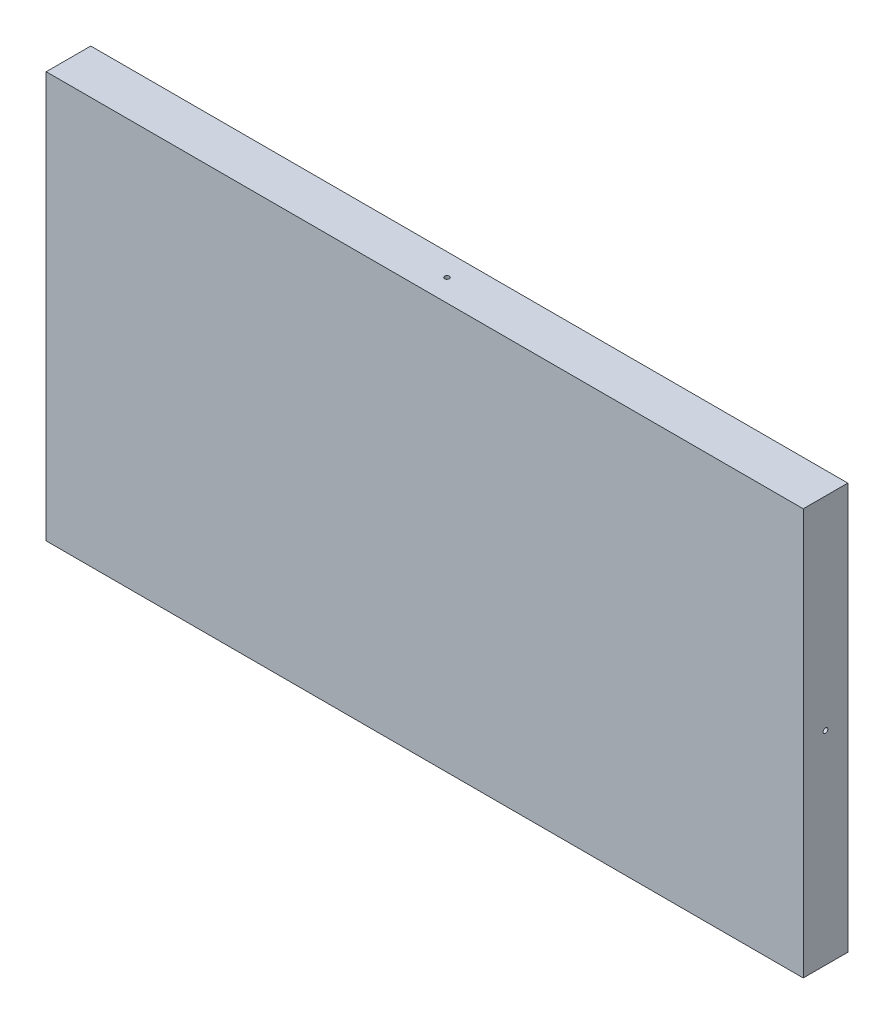
ISO-10303-21;
HEADER;
FILE_DESCRIPTION(('STEP AP214'),'2;1');
FILE_NAME('part.step','',(''),(''),'','','');
FILE_SCHEMA(('AUTOMOTIVE_DESIGN { 1 0 10303 214 1 1 1 1 }'));
ENDSEC;
DATA;
#1=APPLICATION_CONTEXT('core data for automotive mechanical design processes');
#2=APPLICATION_PROTOCOL_DEFINITION('international standard','automotive_design',2000,#1);
#3=PRODUCT_CONTEXT('',#1,'mechanical');
#4=PRODUCT('Part','Part','',(#3));
#5=PRODUCT_RELATED_PRODUCT_CATEGORY('part','',(#4));
#6=PRODUCT_DEFINITION_FORMATION('','',#4);
#7=PRODUCT_DEFINITION_CONTEXT('part definition',#1,'design');
#8=PRODUCT_DEFINITION('design','',#6,#7);
#9=PRODUCT_DEFINITION_SHAPE('','',#8);
#10=(LENGTH_UNIT() NAMED_UNIT(*) SI_UNIT(.MILLI.,.METRE.));
#11=(NAMED_UNIT(*) PLANE_ANGLE_UNIT() SI_UNIT($,.RADIAN.));
#12=(NAMED_UNIT(*) SI_UNIT($,.STERADIAN.) SOLID_ANGLE_UNIT());
#13=UNCERTAINTY_MEASURE_WITH_UNIT(LENGTH_MEASURE(1.E-05),#10,'distance_accuracy_value','');
#14=(GEOMETRIC_REPRESENTATION_CONTEXT(3) GLOBAL_UNCERTAINTY_ASSIGNED_CONTEXT((#13)) GLOBAL_UNIT_ASSIGNED_CONTEXT((#10,
#11,#12)) REPRESENTATION_CONTEXT('',''));
#15=CARTESIAN_POINT('',(0.,0.,0.));
#16=DIRECTION('',(0.,0.,1.));
#17=DIRECTION('',(1.,0.,0.));
#18=AXIS2_PLACEMENT_3D('',#15,#16,#17);
#19=CARTESIAN_POINT('',(0.,-182.5,20.));
#20=DIRECTION('',(0.,-1.,0.));
#21=DIRECTION('',(0.,0.,-1.));
#22=AXIS2_PLACEMENT_3D('',#19,#20,#21);
#23=CYLINDRICAL_SURFACE('',#22,2.09999999999997);
#24=CARTESIAN_POINT('',(0.,-182.5,20.));
#25=DIRECTION('',(0.,-1.,0.));
#26=DIRECTION('',(0.,0.,-1.));
#27=AXIS2_PLACEMENT_3D('',#24,#25,#26);
#28=CIRCLE('',#27,2.09999999999999);
#29=CARTESIAN_POINT('',(0.,-182.5,17.9));
#30=VERTEX_POINT('',#29);
#31=EDGE_CURVE('E154',#30,#30,#28,.T.);
#32=ORIENTED_EDGE('',*,*,#31,.T.);
#33=EDGE_LOOP('',(#32));
#34=FACE_BOUND('',#33,.T.);
#35=CARTESIAN_POINT('',(0.,0.,20.));
#36=DIRECTION('',(0.707106781186547,-0.707106781186547,0.));
#37=DIRECTION('',(-0.707106781186547,-0.707106781186547,0.));
#38=AXIS2_PLACEMENT_3D('',#35,#36,#37);
#39=ELLIPSE('',#38,2.96984848098344,2.09999999999996);
#40=CARTESIAN_POINT('',(0.,0.,17.9));
#41=VERTEX_POINT('',#40);
#42=CARTESIAN_POINT('',(0.,0.,22.1));
#43=VERTEX_POINT('',#42);
#44=EDGE_CURVE('E57',#41,#43,#39,.F.);
#45=ORIENTED_EDGE('',*,*,#44,.T.);
#46=CARTESIAN_POINT('',(0.,0.,20.));
#47=DIRECTION('',(-0.707106781186547,-0.707106781186547,0.));
#48=DIRECTION('',(0.707106781186547,-0.707106781186547,0.));
#49=AXIS2_PLACEMENT_3D('',#46,#47,#48);
#50=ELLIPSE('',#49,2.96984848098344,2.09999999999996);
#51=EDGE_CURVE('E11',#43,#41,#50,.F.);
#52=ORIENTED_EDGE('',*,*,#51,.T.);
#53=EDGE_LOOP('',(#45,#52));
#54=FACE_BOUND('',#53,.T.);
#55=ADVANCED_FACE('F43',(#34,#54),#23,.F.);
#56=CARTESIAN_POINT('',(340.,182.5,40.));
#57=DIRECTION('',(-1.,0.,0.));
#58=DIRECTION('',(0.,-1.,0.));
#59=AXIS2_PLACEMENT_3D('',#56,#57,#58);
#60=PLANE('',#59);
#61=CARTESIAN_POINT('',(340.,0.,20.));
#62=DIRECTION('',(-1.,0.,0.));
#63=DIRECTION('',(0.,0.,1.));
#64=AXIS2_PLACEMENT_3D('',#61,#62,#63);
#65=CIRCLE('',#64,2.09999999999992);
#66=CARTESIAN_POINT('',(340.,0.,22.0999999999999));
#67=VERTEX_POINT('',#66);
#68=EDGE_CURVE('E158',#67,#67,#65,.T.);
#69=ORIENTED_EDGE('',*,*,#68,.T.);
#70=EDGE_LOOP('',(#69));
#71=FACE_BOUND('',#70,.T.);
#72=DIRECTION('',(0.,1.,0.));
#73=VECTOR('',#72,1.);
#74=CARTESIAN_POINT('',(340.,182.5,0.));
#75=LINE('',#74,#73);
#76=CARTESIAN_POINT('',(340.,-182.5,0.));
#77=VERTEX_POINT('',#76);
#78=CARTESIAN_POINT('',(340.,182.5,0.));
#79=VERTEX_POINT('',#78);
#80=EDGE_CURVE('E137',#77,#79,#75,.T.);
#81=ORIENTED_EDGE('',*,*,#80,.T.);
#82=DIRECTION('',(0.,0.,-1.));
#83=VECTOR('',#82,1.);
#84=CARTESIAN_POINT('',(340.,182.5,40.));
#85=LINE('',#84,#83);
#86=CARTESIAN_POINT('',(340.,182.5,40.));
#87=VERTEX_POINT('',#86);
#88=EDGE_CURVE('E110',#87,#79,#85,.T.);
#89=ORIENTED_EDGE('',*,*,#88,.F.);
#90=DIRECTION('',(0.,1.,0.));
#91=VECTOR('',#90,1.);
#92=CARTESIAN_POINT('',(340.,182.5,40.));
#93=LINE('',#92,#91);
#94=CARTESIAN_POINT('',(340.,-182.5,40.));
#95=VERTEX_POINT('',#94);
#96=EDGE_CURVE('E130',#95,#87,#93,.T.);
#97=ORIENTED_EDGE('',*,*,#96,.F.);
#98=DIRECTION('',(0.,0.,-1.));
#99=VECTOR('',#98,1.);
#100=CARTESIAN_POINT('',(340.,-182.5,40.));
#101=LINE('',#100,#99);
#102=EDGE_CURVE('E125',#95,#77,#101,.T.);
#103=ORIENTED_EDGE('',*,*,#102,.T.);
#104=EDGE_LOOP('',(#81,#89,#97,#103));
#105=FACE_BOUND('',#104,.T.);
#106=ADVANCED_FACE('F45',(#71,#105),#60,.F.);
#107=CARTESIAN_POINT('',(-340.,182.5,40.));
#108=DIRECTION('',(0.,-1.,0.));
#109=DIRECTION('',(1.,0.,0.));
#110=AXIS2_PLACEMENT_3D('',#107,#108,#109);
#111=PLANE('',#110);
#112=CARTESIAN_POINT('',(0.,182.5,20.));
#113=DIRECTION('',(0.,-1.,0.));
#114=DIRECTION('',(0.,0.,-1.));
#115=AXIS2_PLACEMENT_3D('',#112,#113,#114);
#116=CIRCLE('',#115,2.09999999999995);
#117=CARTESIAN_POINT('',(0.,182.5,17.9));
#118=VERTEX_POINT('',#117);
#119=EDGE_CURVE('E141',#118,#118,#116,.T.);
#120=ORIENTED_EDGE('',*,*,#119,.T.);
#121=EDGE_LOOP('',(#120));
#122=FACE_BOUND('',#121,.T.);
#123=DIRECTION('',(-1.,0.,0.));
#124=VECTOR('',#123,1.);
#125=CARTESIAN_POINT('',(-340.,182.5,0.));
#126=LINE('',#125,#124);
#127=CARTESIAN_POINT('',(-340.,182.5,0.));
#128=VERTEX_POINT('',#127);
#129=EDGE_CURVE('E134',#79,#128,#126,.T.);
#130=ORIENTED_EDGE('',*,*,#129,.T.);
#131=DIRECTION('',(0.,0.,-1.));
#132=VECTOR('',#131,1.);
#133=CARTESIAN_POINT('',(-340.,182.5,40.));
#134=LINE('',#133,#132);
#135=CARTESIAN_POINT('',(-340.,182.5,40.));
#136=VERTEX_POINT('',#135);
#137=EDGE_CURVE('E118',#136,#128,#134,.T.);
#138=ORIENTED_EDGE('',*,*,#137,.F.);
#139=DIRECTION('',(-1.,0.,0.));
#140=VECTOR('',#139,1.);
#141=CARTESIAN_POINT('',(-340.,182.5,40.));
#142=LINE('',#141,#140);
#143=EDGE_CURVE('E95',#87,#136,#142,.T.);
#144=ORIENTED_EDGE('',*,*,#143,.F.);
#145=ORIENTED_EDGE('',*,*,#88,.T.);
#146=EDGE_LOOP('',(#130,#138,#144,#145));
#147=FACE_BOUND('',#146,.T.);
#148=ADVANCED_FACE('F172',(#122,#147),#111,.F.);
#149=CARTESIAN_POINT('',(-340.,182.5,40.));
#150=DIRECTION('',(1.,0.,0.));
#151=DIRECTION('',(0.,1.,0.));
#152=AXIS2_PLACEMENT_3D('',#149,#150,#151);
#153=PLANE('',#152);
#154=CARTESIAN_POINT('',(-340.,0.,20.));
#155=DIRECTION('',(-1.,0.,0.));
#156=DIRECTION('',(0.,0.,1.));
#157=AXIS2_PLACEMENT_3D('',#154,#155,#156);
#158=CIRCLE('',#157,2.09999999999999);
#159=CARTESIAN_POINT('',(-340.,0.,22.1));
#160=VERTEX_POINT('',#159);
#161=EDGE_CURVE('E162',#160,#160,#158,.T.);
#162=ORIENTED_EDGE('',*,*,#161,.F.);
#163=EDGE_LOOP('',(#162));
#164=FACE_BOUND('',#163,.T.);
#165=DIRECTION('',(0.,-1.,0.));
#166=VECTOR('',#165,1.);
#167=CARTESIAN_POINT('',(-340.,182.5,0.));
#168=LINE('',#167,#166);
#169=CARTESIAN_POINT('',(-340.,-182.5,0.));
#170=VERTEX_POINT('',#169);
#171=EDGE_CURVE('E131',#128,#170,#168,.T.);
#172=ORIENTED_EDGE('',*,*,#171,.T.);
#173=DIRECTION('',(0.,0.,-1.));
#174=VECTOR('',#173,1.);
#175=CARTESIAN_POINT('',(-340.,-182.5,40.));
#176=LINE('',#175,#174);
#177=CARTESIAN_POINT('',(-340.,-182.5,40.));
#178=VERTEX_POINT('',#177);
#179=EDGE_CURVE('E122',#178,#170,#176,.T.);
#180=ORIENTED_EDGE('',*,*,#179,.F.);
#181=DIRECTION('',(0.,-1.,0.));
#182=VECTOR('',#181,1.);
#183=CARTESIAN_POINT('',(-340.,182.5,40.));
#184=LINE('',#183,#182);
#185=EDGE_CURVE('E144',#136,#178,#184,.T.);
#186=ORIENTED_EDGE('',*,*,#185,.F.);
#187=ORIENTED_EDGE('',*,*,#137,.T.);
#188=EDGE_LOOP('',(#172,#180,#186,#187));
#189=FACE_BOUND('',#188,.T.);
#190=ADVANCED_FACE('F168',(#164,#189),#153,.F.);
#191=CARTESIAN_POINT('',(-340.,-182.5,40.));
#192=DIRECTION('',(0.,1.,0.));
#193=DIRECTION('',(0.,0.,1.));
#194=AXIS2_PLACEMENT_3D('',#191,#192,#193);
#195=PLANE('',#194);
#196=ORIENTED_EDGE('',*,*,#31,.F.);
#197=EDGE_LOOP('',(#196));
#198=FACE_BOUND('',#197,.T.);
#199=DIRECTION('',(1.,0.,0.));
#200=VECTOR('',#199,1.);
#201=CARTESIAN_POINT('',(-340.,-182.5,0.));
#202=LINE('',#201,#200);
#203=EDGE_CURVE('E87',#170,#77,#202,.T.);
#204=ORIENTED_EDGE('',*,*,#203,.T.);
#205=ORIENTED_EDGE('',*,*,#102,.F.);
#206=DIRECTION('',(1.,0.,0.));
#207=VECTOR('',#206,1.);
#208=CARTESIAN_POINT('',(-340.,-182.5,40.));
#209=LINE('',#208,#207);
#210=EDGE_CURVE('E66',#178,#95,#209,.T.);
#211=ORIENTED_EDGE('',*,*,#210,.F.);
#212=ORIENTED_EDGE('',*,*,#179,.T.);
#213=EDGE_LOOP('',(#204,#205,#211,#212));
#214=FACE_BOUND('',#213,.T.);
#215=ADVANCED_FACE('F171',(#198,#214),#195,.F.);
#216=CARTESIAN_POINT('',(0.,0.,40.));
#217=DIRECTION('',(0.,0.,1.));
#218=DIRECTION('',(1.,0.,0.));
#219=AXIS2_PLACEMENT_3D('',#216,#217,#218);
#220=PLANE('',#219);
#221=ORIENTED_EDGE('',*,*,#96,.T.);
#222=ORIENTED_EDGE('',*,*,#143,.T.);
#223=ORIENTED_EDGE('',*,*,#185,.T.);
#224=ORIENTED_EDGE('',*,*,#210,.T.);
#225=EDGE_LOOP('',(#221,#222,#223,#224));
#226=FACE_BOUND('',#225,.T.);
#227=ADVANCED_FACE('F183',(#226),#220,.T.);
#228=CARTESIAN_POINT('',(0.,0.,0.));
#229=DIRECTION('',(0.,0.,1.));
#230=DIRECTION('',(1.,0.,0.));
#231=AXIS2_PLACEMENT_3D('',#228,#229,#230);
#232=PLANE('',#231);
#233=ORIENTED_EDGE('',*,*,#80,.F.);
#234=ORIENTED_EDGE('',*,*,#203,.F.);
#235=ORIENTED_EDGE('',*,*,#171,.F.);
#236=ORIENTED_EDGE('',*,*,#129,.F.);
#237=EDGE_LOOP('',(#233,#234,#235,#236));
#238=FACE_BOUND('',#237,.T.);
#239=ADVANCED_FACE('F179',(#238),#232,.F.);
#240=CARTESIAN_POINT('',(0.,0.,20.));
#241=DIRECTION('',(0.707106781186547,-0.707106781186547,0.));
#242=DIRECTION('',(-0.707106781186547,-0.707106781186547,0.));
#243=AXIS2_PLACEMENT_3D('',#240,#241,#242);
#244=ELLIPSE('',#243,2.96984848098344,2.09999999999996);
#245=EDGE_CURVE('E101',#41,#43,#244,.T.);
#246=ORIENTED_EDGE('',*,*,#245,.T.);
#247=CARTESIAN_POINT('',(0.,0.,20.));
#248=DIRECTION('',(-0.707106781186547,-0.707106781186547,0.));
#249=DIRECTION('',(0.707106781186547,-0.707106781186547,0.));
#250=AXIS2_PLACEMENT_3D('',#247,#248,#249);
#251=ELLIPSE('',#250,2.96984848098344,2.09999999999996);
#252=EDGE_CURVE('E52',#43,#41,#251,.T.);
#253=ORIENTED_EDGE('',*,*,#252,.T.);
#254=EDGE_LOOP('',(#246,#253));
#255=FACE_BOUND('',#254,.T.);
#256=ORIENTED_EDGE('',*,*,#119,.F.);
#257=EDGE_LOOP('',(#256));
#258=FACE_BOUND('',#257,.T.);
#259=ADVANCED_FACE('F112',(#255,#258),#23,.F.);
#260=CARTESIAN_POINT('',(-340.,0.,20.));
#261=DIRECTION('',(-1.,0.,0.));
#262=DIRECTION('',(0.,0.,1.));
#263=AXIS2_PLACEMENT_3D('',#260,#261,#262);
#264=CYLINDRICAL_SURFACE('',#263,2.09999999999995);
#265=ORIENTED_EDGE('',*,*,#161,.T.);
#266=EDGE_LOOP('',(#265));
#267=FACE_BOUND('',#266,.T.);
#268=ORIENTED_EDGE('',*,*,#44,.F.);
#269=ORIENTED_EDGE('',*,*,#252,.F.);
#270=EDGE_LOOP('',(#268,#269));
#271=FACE_BOUND('',#270,.T.);
#272=ADVANCED_FACE('F108',(#267,#271),#264,.F.);
#273=ORIENTED_EDGE('',*,*,#68,.F.);
#274=EDGE_LOOP('',(#273));
#275=FACE_BOUND('',#274,.T.);
#276=ORIENTED_EDGE('',*,*,#245,.F.);
#277=ORIENTED_EDGE('',*,*,#51,.F.);
#278=EDGE_LOOP('',(#276,#277));
#279=FACE_BOUND('',#278,.T.);
#280=ADVANCED_FACE('F102',(#275,#279),#264,.F.);
#281=CLOSED_SHELL('',(#55,#106,#148,#190,#215,#227,#239,#259,#272,#280));
#282=MANIFOLD_SOLID_BREP('B2',#281);
#283=ADVANCED_BREP_SHAPE_REPRESENTATION('',(#18,#282),#14);
#284=SHAPE_DEFINITION_REPRESENTATION(#9,#283);
ENDSEC;
END-ISO-10303-21;
